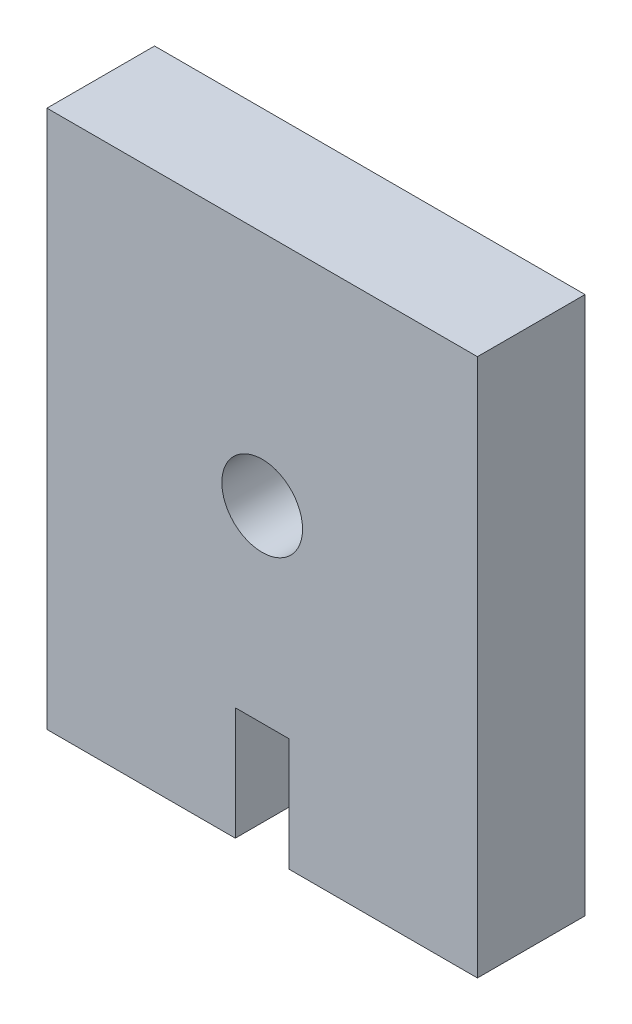
ISO-10303-21;
HEADER;
FILE_DESCRIPTION(('STEP AP214'),'2;1');
FILE_NAME('part.step','',(''),(''),'','','');
FILE_SCHEMA(('AUTOMOTIVE_DESIGN { 1 0 10303 214 1 1 1 1 }'));
ENDSEC;
DATA;
#1=APPLICATION_CONTEXT('core data for automotive mechanical design processes');
#2=APPLICATION_PROTOCOL_DEFINITION('international standard','automotive_design',2000,#1);
#3=PRODUCT_CONTEXT('',#1,'mechanical');
#4=PRODUCT('Part','Part','',(#3));
#5=PRODUCT_RELATED_PRODUCT_CATEGORY('part','',(#4));
#6=PRODUCT_DEFINITION_FORMATION('','',#4);
#7=PRODUCT_DEFINITION_CONTEXT('part definition',#1,'design');
#8=PRODUCT_DEFINITION('design','',#6,#7);
#9=PRODUCT_DEFINITION_SHAPE('','',#8);
#10=(LENGTH_UNIT() NAMED_UNIT(*) SI_UNIT(.MILLI.,.METRE.));
#11=(NAMED_UNIT(*) PLANE_ANGLE_UNIT() SI_UNIT($,.RADIAN.));
#12=(NAMED_UNIT(*) SI_UNIT($,.STERADIAN.) SOLID_ANGLE_UNIT());
#13=UNCERTAINTY_MEASURE_WITH_UNIT(LENGTH_MEASURE(1.E-05),#10,'distance_accuracy_value','');
#14=(GEOMETRIC_REPRESENTATION_CONTEXT(3) GLOBAL_UNCERTAINTY_ASSIGNED_CONTEXT((#13)) GLOBAL_UNIT_ASSIGNED_CONTEXT((#10,
#11,#12)) REPRESENTATION_CONTEXT('',''));
#15=CARTESIAN_POINT('',(0.,0.,0.));
#16=DIRECTION('',(0.,0.,1.));
#17=DIRECTION('',(1.,0.,0.));
#18=AXIS2_PLACEMENT_3D('',#15,#16,#17);
#19=CARTESIAN_POINT('',(-80.,80.,40.));
#20=DIRECTION('',(1.,0.,0.));
#21=DIRECTION('',(0.,1.,0.));
#22=AXIS2_PLACEMENT_3D('',#19,#20,#21);
#23=PLANE('',#22);
#24=DIRECTION('',(0.,-1.,0.));
#25=VECTOR('',#24,1.);
#26=CARTESIAN_POINT('',(-80.,80.,0.));
#27=LINE('',#26,#25);
#28=CARTESIAN_POINT('',(-80.,80.,0.));
#29=VERTEX_POINT('',#28);
#30=CARTESIAN_POINT('',(-80.,-120.,0.));
#31=VERTEX_POINT('',#30);
#32=EDGE_CURVE('E140',#29,#31,#27,.T.);
#33=ORIENTED_EDGE('',*,*,#32,.T.);
#34=DIRECTION('',(0.,0.,-1.));
#35=VECTOR('',#34,1.);
#36=CARTESIAN_POINT('',(-80.,-120.,40.));
#37=LINE('',#36,#35);
#38=CARTESIAN_POINT('',(-80.,-120.,40.));
#39=VERTEX_POINT('',#38);
#40=EDGE_CURVE('E11',#39,#31,#37,.T.);
#41=ORIENTED_EDGE('',*,*,#40,.F.);
#42=DIRECTION('',(0.,-1.,0.));
#43=VECTOR('',#42,1.);
#44=CARTESIAN_POINT('',(-80.,80.,40.));
#45=LINE('',#44,#43);
#46=CARTESIAN_POINT('',(-80.,80.,40.));
#47=VERTEX_POINT('',#46);
#48=EDGE_CURVE('E145',#47,#39,#45,.T.);
#49=ORIENTED_EDGE('',*,*,#48,.F.);
#50=DIRECTION('',(0.,0.,-1.));
#51=VECTOR('',#50,1.);
#52=CARTESIAN_POINT('',(-80.,80.,40.));
#53=LINE('',#52,#51);
#54=EDGE_CURVE('E152',#47,#29,#53,.T.);
#55=ORIENTED_EDGE('',*,*,#54,.T.);
#56=EDGE_LOOP('',(#33,#41,#49,#55));
#57=FACE_BOUND('',#56,.T.);
#58=ADVANCED_FACE('F32',(#57),#23,.F.);
#59=CARTESIAN_POINT('',(-80.,-120.,40.));
#60=DIRECTION('',(0.,1.,0.));
#61=DIRECTION('',(0.,0.,1.));
#62=AXIS2_PLACEMENT_3D('',#59,#60,#61);
#63=PLANE('',#62);
#64=DIRECTION('',(1.,0.,0.));
#65=VECTOR('',#64,1.);
#66=CARTESIAN_POINT('',(-10.,-120.,11.));
#67=LINE('',#66,#65);
#68=CARTESIAN_POINT('',(-10.,-120.,11.));
#69=VERTEX_POINT('',#68);
#70=CARTESIAN_POINT('',(10.,-120.,11.));
#71=VERTEX_POINT('',#70);
#72=EDGE_CURVE('E127',#69,#71,#67,.T.);
#73=ORIENTED_EDGE('',*,*,#72,.F.);
#74=DIRECTION('',(0.,0.,-1.));
#75=VECTOR('',#74,1.);
#76=CARTESIAN_POINT('',(-10.,-120.,40.));
#77=LINE('',#76,#75);
#78=CARTESIAN_POINT('',(-10.,-120.,40.));
#79=VERTEX_POINT('',#78);
#80=EDGE_CURVE('E112',#79,#69,#77,.T.);
#81=ORIENTED_EDGE('',*,*,#80,.F.);
#82=DIRECTION('',(1.,0.,0.));
#83=VECTOR('',#82,1.);
#84=CARTESIAN_POINT('',(-80.,-120.,40.));
#85=LINE('',#84,#83);
#86=EDGE_CURVE('E83',#39,#79,#85,.T.);
#87=ORIENTED_EDGE('',*,*,#86,.F.);
#88=ORIENTED_EDGE('',*,*,#40,.T.);
#89=DIRECTION('',(1.,0.,0.));
#90=VECTOR('',#89,1.);
#91=CARTESIAN_POINT('',(-80.,-120.,0.));
#92=LINE('',#91,#90);
#93=CARTESIAN_POINT('',(80.,-120.,0.));
#94=VERTEX_POINT('',#93);
#95=EDGE_CURVE('E155',#31,#94,#92,.T.);
#96=ORIENTED_EDGE('',*,*,#95,.T.);
#97=DIRECTION('',(0.,0.,-1.));
#98=VECTOR('',#97,1.);
#99=CARTESIAN_POINT('',(80.,-120.,40.));
#100=LINE('',#99,#98);
#101=CARTESIAN_POINT('',(80.,-120.,40.));
#102=VERTEX_POINT('',#101);
#103=EDGE_CURVE('E39',#102,#94,#100,.T.);
#104=ORIENTED_EDGE('',*,*,#103,.F.);
#105=CARTESIAN_POINT('',(10.,-120.,40.));
#106=VERTEX_POINT('',#105);
#107=EDGE_CURVE('E147',#106,#102,#85,.T.);
#108=ORIENTED_EDGE('',*,*,#107,.F.);
#109=DIRECTION('',(0.,0.,1.));
#110=VECTOR('',#109,1.);
#111=CARTESIAN_POINT('',(10.,-120.,40.));
#112=LINE('',#111,#110);
#113=EDGE_CURVE('E125',#71,#106,#112,.T.);
#114=ORIENTED_EDGE('',*,*,#113,.F.);
#115=EDGE_LOOP('',(#73,#81,#87,#88,#96,#104,#108,#114));
#116=FACE_BOUND('',#115,.T.);
#117=ADVANCED_FACE('F186',(#116),#63,.F.);
#118=CARTESIAN_POINT('',(80.,80.,40.));
#119=DIRECTION('',(-1.,0.,0.));
#120=DIRECTION('',(0.,0.,1.));
#121=AXIS2_PLACEMENT_3D('',#118,#119,#120);
#122=PLANE('',#121);
#123=DIRECTION('',(0.,1.,0.));
#124=VECTOR('',#123,1.);
#125=CARTESIAN_POINT('',(80.,80.,0.));
#126=LINE('',#125,#124);
#127=CARTESIAN_POINT('',(80.,80.,0.));
#128=VERTEX_POINT('',#127);
#129=EDGE_CURVE('E157',#94,#128,#126,.T.);
#130=ORIENTED_EDGE('',*,*,#129,.T.);
#131=DIRECTION('',(0.,0.,-1.));
#132=VECTOR('',#131,1.);
#133=CARTESIAN_POINT('',(80.,80.,40.));
#134=LINE('',#133,#132);
#135=CARTESIAN_POINT('',(80.,80.,40.));
#136=VERTEX_POINT('',#135);
#137=EDGE_CURVE('E161',#136,#128,#134,.T.);
#138=ORIENTED_EDGE('',*,*,#137,.F.);
#139=DIRECTION('',(0.,1.,0.));
#140=VECTOR('',#139,1.);
#141=CARTESIAN_POINT('',(80.,80.,40.));
#142=LINE('',#141,#140);
#143=EDGE_CURVE('E149',#102,#136,#142,.T.);
#144=ORIENTED_EDGE('',*,*,#143,.F.);
#145=ORIENTED_EDGE('',*,*,#103,.T.);
#146=EDGE_LOOP('',(#130,#138,#144,#145));
#147=FACE_BOUND('',#146,.T.);
#148=ADVANCED_FACE('F167',(#147),#122,.F.);
#149=CARTESIAN_POINT('',(-80.,80.,40.));
#150=DIRECTION('',(0.,-1.,0.));
#151=DIRECTION('',(0.,0.,-1.));
#152=AXIS2_PLACEMENT_3D('',#149,#150,#151);
#153=PLANE('',#152);
#154=DIRECTION('',(-1.,0.,0.));
#155=VECTOR('',#154,1.);
#156=CARTESIAN_POINT('',(-80.,80.,0.));
#157=LINE('',#156,#155);
#158=EDGE_CURVE('E76',#128,#29,#157,.T.);
#159=ORIENTED_EDGE('',*,*,#158,.T.);
#160=ORIENTED_EDGE('',*,*,#54,.F.);
#161=DIRECTION('',(-1.,0.,0.));
#162=VECTOR('',#161,1.);
#163=CARTESIAN_POINT('',(-80.,80.,40.));
#164=LINE('',#163,#162);
#165=EDGE_CURVE('E55',#136,#47,#164,.T.);
#166=ORIENTED_EDGE('',*,*,#165,.F.);
#167=ORIENTED_EDGE('',*,*,#137,.T.);
#168=EDGE_LOOP('',(#159,#160,#166,#167));
#169=FACE_BOUND('',#168,.T.);
#170=ADVANCED_FACE('F176',(#169),#153,.F.);
#171=CARTESIAN_POINT('',(0.,0.,40.));
#172=DIRECTION('',(0.,0.,1.));
#173=DIRECTION('',(1.,0.,0.));
#174=AXIS2_PLACEMENT_3D('',#171,#172,#173);
#175=PLANE('',#174);
#176=CARTESIAN_POINT('',(0.,-8.,40.));
#177=DIRECTION('',(0.,0.,1.));
#178=DIRECTION('',(1.,0.,0.));
#179=AXIS2_PLACEMENT_3D('',#176,#177,#178);
#180=CIRCLE('',#179,15.);
#181=CARTESIAN_POINT('',(15.,-8.,40.));
#182=VERTEX_POINT('',#181);
#183=EDGE_CURVE('E130',#182,#182,#180,.T.);
#184=ORIENTED_EDGE('',*,*,#183,.F.);
#185=EDGE_LOOP('',(#184));
#186=FACE_BOUND('',#185,.T.);
#187=DIRECTION('',(0.,-1.,0.));
#188=VECTOR('',#187,1.);
#189=CARTESIAN_POINT('',(-10.,-78.,40.));
#190=LINE('',#189,#188);
#191=CARTESIAN_POINT('',(-10.,-78.,40.));
#192=VERTEX_POINT('',#191);
#193=EDGE_CURVE('E138',#192,#79,#190,.T.);
#194=ORIENTED_EDGE('',*,*,#193,.F.);
#195=DIRECTION('',(-1.,0.,0.));
#196=VECTOR('',#195,1.);
#197=CARTESIAN_POINT('',(-10.,-78.,40.));
#198=LINE('',#197,#196);
#199=CARTESIAN_POINT('',(10.,-78.,40.));
#200=VERTEX_POINT('',#199);
#201=EDGE_CURVE('E117',#200,#192,#198,.T.);
#202=ORIENTED_EDGE('',*,*,#201,.F.);
#203=DIRECTION('',(0.,-1.,0.));
#204=VECTOR('',#203,1.);
#205=CARTESIAN_POINT('',(10.,-78.,40.));
#206=LINE('',#205,#204);
#207=EDGE_CURVE('E141',#200,#106,#206,.T.);
#208=ORIENTED_EDGE('',*,*,#207,.T.);
#209=ORIENTED_EDGE('',*,*,#107,.T.);
#210=ORIENTED_EDGE('',*,*,#143,.T.);
#211=ORIENTED_EDGE('',*,*,#165,.T.);
#212=ORIENTED_EDGE('',*,*,#48,.T.);
#213=ORIENTED_EDGE('',*,*,#86,.T.);
#214=EDGE_LOOP('',(#194,#202,#208,#209,#210,#211,#212,#213));
#215=FACE_BOUND('',#214,.T.);
#216=ADVANCED_FACE('F178',(#186,#215),#175,.T.);
#217=CARTESIAN_POINT('',(0.,0.,0.));
#218=DIRECTION('',(0.,0.,1.));
#219=DIRECTION('',(1.,0.,0.));
#220=AXIS2_PLACEMENT_3D('',#217,#218,#219);
#221=PLANE('',#220);
#222=ORIENTED_EDGE('',*,*,#32,.F.);
#223=ORIENTED_EDGE('',*,*,#158,.F.);
#224=ORIENTED_EDGE('',*,*,#129,.F.);
#225=ORIENTED_EDGE('',*,*,#95,.F.);
#226=EDGE_LOOP('',(#222,#223,#224,#225));
#227=FACE_BOUND('',#226,.T.);
#228=ADVANCED_FACE('F172',(#227),#221,.F.);
#229=CARTESIAN_POINT('',(-10.,-78.,40.));
#230=DIRECTION('',(-1.,0.,0.));
#231=DIRECTION('',(0.,0.,1.));
#232=AXIS2_PLACEMENT_3D('',#229,#230,#231);
#233=PLANE('',#232);
#234=ORIENTED_EDGE('',*,*,#80,.T.);
#235=DIRECTION('',(0.,-1.,0.));
#236=VECTOR('',#235,1.);
#237=CARTESIAN_POINT('',(-10.,-78.,11.));
#238=LINE('',#237,#236);
#239=CARTESIAN_POINT('',(-10.,-78.,11.));
#240=VERTEX_POINT('',#239);
#241=EDGE_CURVE('E107',#240,#69,#238,.T.);
#242=ORIENTED_EDGE('',*,*,#241,.F.);
#243=DIRECTION('',(0.,0.,-1.));
#244=VECTOR('',#243,1.);
#245=CARTESIAN_POINT('',(-10.,-78.,40.));
#246=LINE('',#245,#244);
#247=EDGE_CURVE('E111',#192,#240,#246,.T.);
#248=ORIENTED_EDGE('',*,*,#247,.F.);
#249=ORIENTED_EDGE('',*,*,#193,.T.);
#250=EDGE_LOOP('',(#234,#242,#248,#249));
#251=FACE_BOUND('',#250,.T.);
#252=ADVANCED_FACE('F109',(#251),#233,.F.);
#253=CARTESIAN_POINT('',(10.,-78.,40.));
#254=DIRECTION('',(1.,0.,0.));
#255=DIRECTION('',(0.,0.,-1.));
#256=AXIS2_PLACEMENT_3D('',#253,#254,#255);
#257=PLANE('',#256);
#258=ORIENTED_EDGE('',*,*,#113,.T.);
#259=ORIENTED_EDGE('',*,*,#207,.F.);
#260=DIRECTION('',(0.,0.,1.));
#261=VECTOR('',#260,1.);
#262=CARTESIAN_POINT('',(10.,-78.,40.));
#263=LINE('',#262,#261);
#264=CARTESIAN_POINT('',(10.,-78.,11.));
#265=VERTEX_POINT('',#264);
#266=EDGE_CURVE('E46',#265,#200,#263,.T.);
#267=ORIENTED_EDGE('',*,*,#266,.F.);
#268=DIRECTION('',(0.,-1.,0.));
#269=VECTOR('',#268,1.);
#270=CARTESIAN_POINT('',(10.,-78.,11.));
#271=LINE('',#270,#269);
#272=EDGE_CURVE('E116',#265,#71,#271,.T.);
#273=ORIENTED_EDGE('',*,*,#272,.T.);
#274=EDGE_LOOP('',(#258,#259,#267,#273));
#275=FACE_BOUND('',#274,.T.);
#276=ADVANCED_FACE('F197',(#275),#257,.F.);
#277=CARTESIAN_POINT('',(-10.,-78.,11.));
#278=DIRECTION('',(0.,0.,-1.));
#279=DIRECTION('',(-1.,0.,0.));
#280=AXIS2_PLACEMENT_3D('',#277,#278,#279);
#281=PLANE('',#280);
#282=ORIENTED_EDGE('',*,*,#72,.T.);
#283=ORIENTED_EDGE('',*,*,#272,.F.);
#284=DIRECTION('',(1.,0.,0.));
#285=VECTOR('',#284,1.);
#286=CARTESIAN_POINT('',(-10.,-78.,11.));
#287=LINE('',#286,#285);
#288=EDGE_CURVE('E119',#240,#265,#287,.T.);
#289=ORIENTED_EDGE('',*,*,#288,.F.);
#290=ORIENTED_EDGE('',*,*,#241,.T.);
#291=EDGE_LOOP('',(#282,#283,#289,#290));
#292=FACE_BOUND('',#291,.T.);
#293=ADVANCED_FACE('F120',(#292),#281,.F.);
#294=CARTESIAN_POINT('',(0.,-78.,0.));
#295=DIRECTION('',(0.,-1.,0.));
#296=DIRECTION('',(0.,0.,-1.));
#297=AXIS2_PLACEMENT_3D('',#294,#295,#296);
#298=PLANE('',#297);
#299=ORIENTED_EDGE('',*,*,#247,.T.);
#300=ORIENTED_EDGE('',*,*,#288,.T.);
#301=ORIENTED_EDGE('',*,*,#266,.T.);
#302=ORIENTED_EDGE('',*,*,#201,.T.);
#303=EDGE_LOOP('',(#299,#300,#301,#302));
#304=FACE_BOUND('',#303,.T.);
#305=ADVANCED_FACE('F122',(#304),#298,.T.);
#306=CARTESIAN_POINT('',(0.,-8.,15.));
#307=DIRECTION('',(0.,0.,1.));
#308=DIRECTION('',(1.,0.,0.));
#309=AXIS2_PLACEMENT_3D('',#306,#307,#308);
#310=CYLINDRICAL_SURFACE('',#309,15.);
#311=CARTESIAN_POINT('',(0.,-8.,15.));
#312=DIRECTION('',(0.,0.,1.));
#313=DIRECTION('',(1.,0.,0.));
#314=AXIS2_PLACEMENT_3D('',#311,#312,#313);
#315=CIRCLE('',#314,15.);
#316=CARTESIAN_POINT('',(15.,-8.,15.));
#317=VERTEX_POINT('',#316);
#318=EDGE_CURVE('E136',#317,#317,#315,.T.);
#319=ORIENTED_EDGE('',*,*,#318,.F.);
#320=EDGE_LOOP('',(#319));
#321=FACE_BOUND('',#320,.T.);
#322=ORIENTED_EDGE('',*,*,#183,.T.);
#323=EDGE_LOOP('',(#322));
#324=FACE_BOUND('',#323,.T.);
#325=ADVANCED_FACE('F237',(#321,#324),#310,.F.);
#326=CARTESIAN_POINT('',(0.,-8.,15.));
#327=DIRECTION('',(0.,0.,1.));
#328=DIRECTION('',(1.,0.,0.));
#329=AXIS2_PLACEMENT_3D('',#326,#327,#328);
#330=PLANE('',#329);
#331=ORIENTED_EDGE('',*,*,#318,.T.);
#332=EDGE_LOOP('',(#331));
#333=FACE_BOUND('',#332,.T.);
#334=ADVANCED_FACE('F251',(#333),#330,.T.);
#335=CLOSED_SHELL('',(#58,#117,#148,#170,#216,#228,#252,#276,#293,#305,#325,#334));
#336=MANIFOLD_SOLID_BREP('B2',#335);
#337=ADVANCED_BREP_SHAPE_REPRESENTATION('',(#18,#336),#14);
#338=SHAPE_DEFINITION_REPRESENTATION(#9,#337);
ENDSEC;
END-ISO-10303-21;
